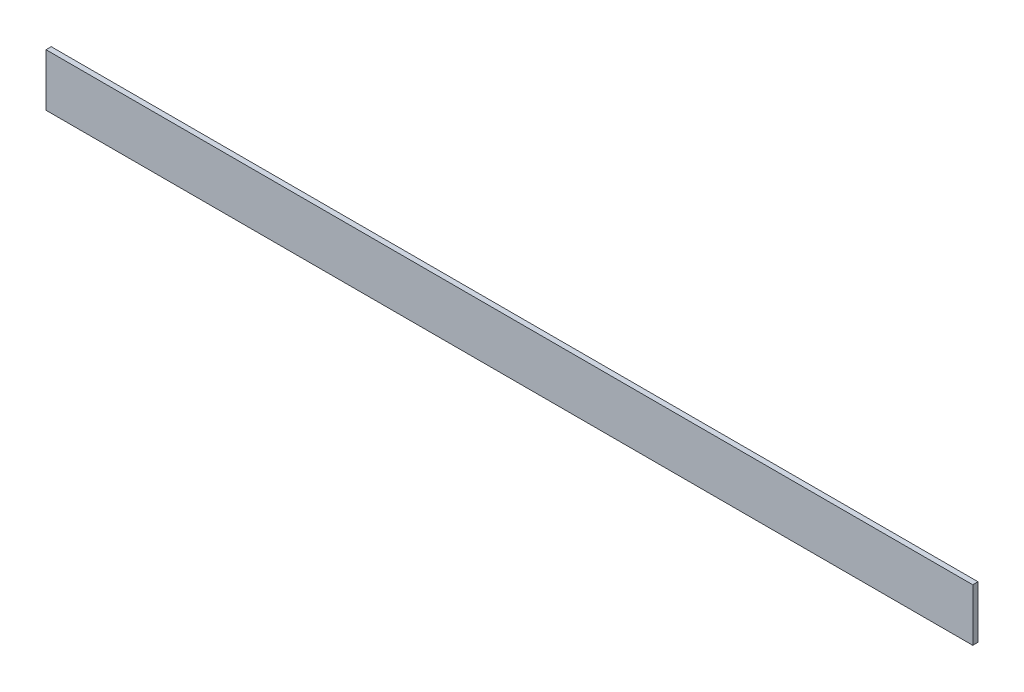
ISO-10303-21;
HEADER;
FILE_DESCRIPTION(('STEP AP214'),'2;1');
FILE_NAME('part.step','',(''),(''),'','','');
FILE_SCHEMA(('AUTOMOTIVE_DESIGN { 1 0 10303 214 1 1 1 1 }'));
ENDSEC;
DATA;
#1=APPLICATION_CONTEXT('core data for automotive mechanical design processes');
#2=APPLICATION_PROTOCOL_DEFINITION('international standard','automotive_design',2000,#1);
#3=PRODUCT_CONTEXT('',#1,'mechanical');
#4=PRODUCT('Part','Part','',(#3));
#5=PRODUCT_RELATED_PRODUCT_CATEGORY('part','',(#4));
#6=PRODUCT_DEFINITION_FORMATION('','',#4);
#7=PRODUCT_DEFINITION_CONTEXT('part definition',#1,'design');
#8=PRODUCT_DEFINITION('design','',#6,#7);
#9=PRODUCT_DEFINITION_SHAPE('','',#8);
#10=(LENGTH_UNIT() NAMED_UNIT(*) SI_UNIT(.MILLI.,.METRE.));
#11=(NAMED_UNIT(*) PLANE_ANGLE_UNIT() SI_UNIT($,.RADIAN.));
#12=(NAMED_UNIT(*) SI_UNIT($,.STERADIAN.) SOLID_ANGLE_UNIT());
#13=UNCERTAINTY_MEASURE_WITH_UNIT(LENGTH_MEASURE(1.E-05),#10,'distance_accuracy_value','');
#14=(GEOMETRIC_REPRESENTATION_CONTEXT(3) GLOBAL_UNCERTAINTY_ASSIGNED_CONTEXT((#13)) GLOBAL_UNIT_ASSIGNED_CONTEXT((#10,
#11,#12)) REPRESENTATION_CONTEXT('',''));
#15=CARTESIAN_POINT('',(0.,0.,0.));
#16=DIRECTION('',(0.,0.,1.));
#17=DIRECTION('',(1.,0.,0.));
#18=AXIS2_PLACEMENT_3D('',#15,#16,#17);
#19=CARTESIAN_POINT('',(530.,0.,0.));
#20=DIRECTION('',(0.,1.,0.));
#21=DIRECTION('',(0.,0.,1.));
#22=AXIS2_PLACEMENT_3D('',#19,#20,#21);
#23=PLANE('',#22);
#24=DIRECTION('',(0.,0.,-1.));
#25=VECTOR('',#24,1.);
#26=CARTESIAN_POINT('',(0.,0.,0.));
#27=LINE('',#26,#25);
#28=CARTESIAN_POINT('',(0.,0.,0.));
#29=VERTEX_POINT('',#28);
#30=CARTESIAN_POINT('',(0.,0.,-3.));
#31=VERTEX_POINT('',#30);
#32=EDGE_CURVE('E136',#29,#31,#27,.T.);
#33=ORIENTED_EDGE('',*,*,#32,.T.);
#34=DIRECTION('',(-1.,0.,0.));
#35=VECTOR('',#34,1.);
#36=CARTESIAN_POINT('',(0.,0.,-3.));
#37=LINE('',#36,#35);
#38=CARTESIAN_POINT('',(30.,0.,-3.));
#39=VERTEX_POINT('',#38);
#40=EDGE_CURVE('E121',#39,#31,#37,.T.);
#41=ORIENTED_EDGE('',*,*,#40,.F.);
#42=DIRECTION('',(0.,0.,1.));
#43=VECTOR('',#42,1.);
#44=CARTESIAN_POINT('',(30.,0.,-30.));
#45=LINE('',#44,#43);
#46=CARTESIAN_POINT('',(30.,0.,-30.));
#47=VERTEX_POINT('',#46);
#48=EDGE_CURVE('E113',#47,#39,#45,.T.);
#49=ORIENTED_EDGE('',*,*,#48,.F.);
#50=DIRECTION('',(-1.,0.,0.));
#51=VECTOR('',#50,1.);
#52=CARTESIAN_POINT('',(530.,0.,-30.));
#53=LINE('',#52,#51);
#54=CARTESIAN_POINT('',(500.,0.,-30.));
#55=VERTEX_POINT('',#54);
#56=EDGE_CURVE('E11',#55,#47,#53,.T.);
#57=ORIENTED_EDGE('',*,*,#56,.F.);
#58=DIRECTION('',(0.,0.,-1.));
#59=VECTOR('',#58,1.);
#60=CARTESIAN_POINT('',(500.,0.,-30.));
#61=LINE('',#60,#59);
#62=CARTESIAN_POINT('',(500.,0.,-2.99999999999999));
#63=VERTEX_POINT('',#62);
#64=EDGE_CURVE('E138',#63,#55,#61,.T.);
#65=ORIENTED_EDGE('',*,*,#64,.F.);
#66=DIRECTION('',(-1.,0.,0.));
#67=VECTOR('',#66,1.);
#68=CARTESIAN_POINT('',(530.,0.,-2.99999999999999));
#69=LINE('',#68,#67);
#70=CARTESIAN_POINT('',(530.,0.,-2.99999999999999));
#71=VERTEX_POINT('',#70);
#72=EDGE_CURVE('E171',#71,#63,#69,.T.);
#73=ORIENTED_EDGE('',*,*,#72,.F.);
#74=DIRECTION('',(0.,0.,-1.));
#75=VECTOR('',#74,1.);
#76=CARTESIAN_POINT('',(530.,0.,0.));
#77=LINE('',#76,#75);
#78=CARTESIAN_POINT('',(530.,0.,0.));
#79=VERTEX_POINT('',#78);
#80=EDGE_CURVE('E143',#79,#71,#77,.T.);
#81=ORIENTED_EDGE('',*,*,#80,.F.);
#82=DIRECTION('',(-1.,0.,0.));
#83=VECTOR('',#82,1.);
#84=CARTESIAN_POINT('',(530.,0.,0.));
#85=LINE('',#84,#83);
#86=EDGE_CURVE('E151',#79,#29,#85,.T.);
#87=ORIENTED_EDGE('',*,*,#86,.T.);
#88=EDGE_LOOP('',(#33,#41,#49,#57,#65,#73,#81,#87));
#89=FACE_BOUND('',#88,.T.);
#90=ADVANCED_FACE('F35',(#89),#23,.F.);
#91=CARTESIAN_POINT('',(530.,3.,-30.));
#92=DIRECTION('',(0.,0.,-1.));
#93=DIRECTION('',(-1.,0.,0.));
#94=AXIS2_PLACEMENT_3D('',#91,#92,#93);
#95=PLANE('',#94);
#96=DIRECTION('',(0.,-1.,0.));
#97=VECTOR('',#96,1.);
#98=CARTESIAN_POINT('',(30.,30.,-30.));
#99=LINE('',#98,#97);
#100=CARTESIAN_POINT('',(30.,3.,-30.));
#101=VERTEX_POINT('',#100);
#102=EDGE_CURVE('E110',#101,#47,#99,.T.);
#103=ORIENTED_EDGE('',*,*,#102,.F.);
#104=DIRECTION('',(-1.,0.,0.));
#105=VECTOR('',#104,1.);
#106=CARTESIAN_POINT('',(530.,3.,-30.));
#107=LINE('',#106,#105);
#108=CARTESIAN_POINT('',(500.,3.,-30.));
#109=VERTEX_POINT('',#108);
#110=EDGE_CURVE('E42',#109,#101,#107,.T.);
#111=ORIENTED_EDGE('',*,*,#110,.F.);
#112=DIRECTION('',(0.,-1.,0.));
#113=VECTOR('',#112,1.);
#114=CARTESIAN_POINT('',(500.,30.,-30.));
#115=LINE('',#114,#113);
#116=EDGE_CURVE('E130',#109,#55,#115,.T.);
#117=ORIENTED_EDGE('',*,*,#116,.T.);
#118=ORIENTED_EDGE('',*,*,#56,.T.);
#119=EDGE_LOOP('',(#103,#111,#117,#118));
#120=FACE_BOUND('',#119,.T.);
#121=ADVANCED_FACE('F129',(#120),#95,.T.);
#122=CARTESIAN_POINT('',(530.,3.,0.));
#123=DIRECTION('',(0.,1.,0.));
#124=DIRECTION('',(0.,0.,1.));
#125=AXIS2_PLACEMENT_3D('',#122,#123,#124);
#126=PLANE('',#125);
#127=DIRECTION('',(0.,0.,-1.));
#128=VECTOR('',#127,1.);
#129=CARTESIAN_POINT('',(30.,3.,0.));
#130=LINE('',#129,#128);
#131=CARTESIAN_POINT('',(30.,3.,-3.));
#132=VERTEX_POINT('',#131);
#133=EDGE_CURVE('E116',#132,#101,#130,.T.);
#134=ORIENTED_EDGE('',*,*,#133,.F.);
#135=DIRECTION('',(-1.,0.,0.));
#136=VECTOR('',#135,1.);
#137=CARTESIAN_POINT('',(530.,3.,-3.));
#138=LINE('',#137,#136);
#139=CARTESIAN_POINT('',(500.,3.,-2.99999999999999));
#140=VERTEX_POINT('',#139);
#141=EDGE_CURVE('E161',#140,#132,#138,.T.);
#142=ORIENTED_EDGE('',*,*,#141,.F.);
#143=DIRECTION('',(0.,0.,1.));
#144=VECTOR('',#143,1.);
#145=CARTESIAN_POINT('',(500.,3.,0.));
#146=LINE('',#145,#144);
#147=EDGE_CURVE('E133',#109,#140,#146,.T.);
#148=ORIENTED_EDGE('',*,*,#147,.F.);
#149=ORIENTED_EDGE('',*,*,#110,.T.);
#150=EDGE_LOOP('',(#134,#142,#148,#149));
#151=FACE_BOUND('',#150,.T.);
#152=ADVANCED_FACE('F164',(#151),#126,.T.);
#153=CARTESIAN_POINT('',(530.,30.,-3.));
#154=DIRECTION('',(0.,0.,-1.));
#155=DIRECTION('',(0.,1.,0.));
#156=AXIS2_PLACEMENT_3D('',#153,#154,#155);
#157=PLANE('',#156);
#158=ORIENTED_EDGE('',*,*,#141,.T.);
#159=DIRECTION('',(0.,-1.,0.));
#160=VECTOR('',#159,1.);
#161=CARTESIAN_POINT('',(30.,30.,-3.));
#162=LINE('',#161,#160);
#163=EDGE_CURVE('E120',#132,#39,#162,.T.);
#164=ORIENTED_EDGE('',*,*,#163,.T.);
#165=ORIENTED_EDGE('',*,*,#40,.T.);
#166=DIRECTION('',(0.,-1.,0.));
#167=VECTOR('',#166,1.);
#168=CARTESIAN_POINT('',(0.,30.,-3.));
#169=LINE('',#168,#167);
#170=CARTESIAN_POINT('',(0.,30.,-3.));
#171=VERTEX_POINT('',#170);
#172=EDGE_CURVE('E49',#171,#31,#169,.T.);
#173=ORIENTED_EDGE('',*,*,#172,.F.);
#174=DIRECTION('',(-1.,0.,0.));
#175=VECTOR('',#174,1.);
#176=CARTESIAN_POINT('',(530.,30.,-3.));
#177=LINE('',#176,#175);
#178=CARTESIAN_POINT('',(530.,30.,-3.));
#179=VERTEX_POINT('',#178);
#180=EDGE_CURVE('E80',#179,#171,#177,.T.);
#181=ORIENTED_EDGE('',*,*,#180,.F.);
#182=DIRECTION('',(0.,-1.,0.));
#183=VECTOR('',#182,1.);
#184=CARTESIAN_POINT('',(530.,30.,-3.));
#185=LINE('',#184,#183);
#186=EDGE_CURVE('E145',#179,#71,#185,.T.);
#187=ORIENTED_EDGE('',*,*,#186,.T.);
#188=ORIENTED_EDGE('',*,*,#72,.T.);
#189=DIRECTION('',(0.,-1.,0.));
#190=VECTOR('',#189,1.);
#191=CARTESIAN_POINT('',(500.,30.,-2.99999999999999));
#192=LINE('',#191,#190);
#193=EDGE_CURVE('E134',#140,#63,#192,.T.);
#194=ORIENTED_EDGE('',*,*,#193,.F.);
#195=EDGE_LOOP('',(#158,#164,#165,#173,#181,#187,#188,#194));
#196=FACE_BOUND('',#195,.T.);
#197=ADVANCED_FACE('F169',(#196),#157,.T.);
#198=CARTESIAN_POINT('',(530.,30.,0.));
#199=DIRECTION('',(0.,1.,0.));
#200=DIRECTION('',(0.,0.,1.));
#201=AXIS2_PLACEMENT_3D('',#198,#199,#200);
#202=PLANE('',#201);
#203=DIRECTION('',(0.,0.,-1.));
#204=VECTOR('',#203,1.);
#205=CARTESIAN_POINT('',(0.,30.,0.));
#206=LINE('',#205,#204);
#207=CARTESIAN_POINT('',(0.,30.,0.));
#208=VERTEX_POINT('',#207);
#209=EDGE_CURVE('E154',#208,#171,#206,.T.);
#210=ORIENTED_EDGE('',*,*,#209,.F.);
#211=DIRECTION('',(-1.,0.,0.));
#212=VECTOR('',#211,1.);
#213=CARTESIAN_POINT('',(530.,30.,0.));
#214=LINE('',#213,#212);
#215=CARTESIAN_POINT('',(530.,30.,0.));
#216=VERTEX_POINT('',#215);
#217=EDGE_CURVE('E158',#216,#208,#214,.T.);
#218=ORIENTED_EDGE('',*,*,#217,.F.);
#219=DIRECTION('',(0.,0.,-1.));
#220=VECTOR('',#219,1.);
#221=CARTESIAN_POINT('',(530.,30.,0.));
#222=LINE('',#221,#220);
#223=EDGE_CURVE('E147',#216,#179,#222,.T.);
#224=ORIENTED_EDGE('',*,*,#223,.T.);
#225=ORIENTED_EDGE('',*,*,#180,.T.);
#226=EDGE_LOOP('',(#210,#218,#224,#225));
#227=FACE_BOUND('',#226,.T.);
#228=ADVANCED_FACE('F179',(#227),#202,.T.);
#229=CARTESIAN_POINT('',(530.,30.,0.));
#230=DIRECTION('',(0.,0.,-1.));
#231=DIRECTION('',(0.,1.,0.));
#232=AXIS2_PLACEMENT_3D('',#229,#230,#231);
#233=PLANE('',#232);
#234=DIRECTION('',(0.,-1.,0.));
#235=VECTOR('',#234,1.);
#236=CARTESIAN_POINT('',(0.,30.,0.));
#237=LINE('',#236,#235);
#238=EDGE_CURVE('E75',#208,#29,#237,.T.);
#239=ORIENTED_EDGE('',*,*,#238,.T.);
#240=ORIENTED_EDGE('',*,*,#86,.F.);
#241=DIRECTION('',(0.,-1.,0.));
#242=VECTOR('',#241,1.);
#243=CARTESIAN_POINT('',(530.,30.,0.));
#244=LINE('',#243,#242);
#245=EDGE_CURVE('E58',#216,#79,#244,.T.);
#246=ORIENTED_EDGE('',*,*,#245,.F.);
#247=ORIENTED_EDGE('',*,*,#217,.T.);
#248=EDGE_LOOP('',(#239,#240,#246,#247));
#249=FACE_BOUND('',#248,.T.);
#250=ADVANCED_FACE('F182',(#249),#233,.F.);
#251=CARTESIAN_POINT('',(530.,0.,0.));
#252=DIRECTION('',(-1.,0.,0.));
#253=DIRECTION('',(0.,0.,1.));
#254=AXIS2_PLACEMENT_3D('',#251,#252,#253);
#255=PLANE('',#254);
#256=ORIENTED_EDGE('',*,*,#80,.T.);
#257=ORIENTED_EDGE('',*,*,#186,.F.);
#258=ORIENTED_EDGE('',*,*,#223,.F.);
#259=ORIENTED_EDGE('',*,*,#245,.T.);
#260=EDGE_LOOP('',(#256,#257,#258,#259));
#261=FACE_BOUND('',#260,.T.);
#262=ADVANCED_FACE('F180',(#261),#255,.F.);
#263=CARTESIAN_POINT('',(0.,0.,0.));
#264=DIRECTION('',(-1.,0.,0.));
#265=DIRECTION('',(0.,0.,1.));
#266=AXIS2_PLACEMENT_3D('',#263,#264,#265);
#267=PLANE('',#266);
#268=ORIENTED_EDGE('',*,*,#172,.T.);
#269=ORIENTED_EDGE('',*,*,#32,.F.);
#270=ORIENTED_EDGE('',*,*,#238,.F.);
#271=ORIENTED_EDGE('',*,*,#209,.T.);
#272=EDGE_LOOP('',(#268,#269,#270,#271));
#273=FACE_BOUND('',#272,.T.);
#274=ADVANCED_FACE('F176',(#273),#267,.T.);
#275=CARTESIAN_POINT('',(500.,30.,-30.));
#276=DIRECTION('',(-1.,0.,0.));
#277=DIRECTION('',(0.,0.,1.));
#278=AXIS2_PLACEMENT_3D('',#275,#276,#277);
#279=PLANE('',#278);
#280=ORIENTED_EDGE('',*,*,#147,.T.);
#281=ORIENTED_EDGE('',*,*,#193,.T.);
#282=ORIENTED_EDGE('',*,*,#64,.T.);
#283=ORIENTED_EDGE('',*,*,#116,.F.);
#284=EDGE_LOOP('',(#280,#281,#282,#283));
#285=FACE_BOUND('',#284,.T.);
#286=ADVANCED_FACE('F167',(#285),#279,.F.);
#287=CARTESIAN_POINT('',(30.,30.,-30.));
#288=DIRECTION('',(1.,0.,0.));
#289=DIRECTION('',(0.,0.,-1.));
#290=AXIS2_PLACEMENT_3D('',#287,#288,#289);
#291=PLANE('',#290);
#292=ORIENTED_EDGE('',*,*,#133,.T.);
#293=ORIENTED_EDGE('',*,*,#102,.T.);
#294=ORIENTED_EDGE('',*,*,#48,.T.);
#295=ORIENTED_EDGE('',*,*,#163,.F.);
#296=EDGE_LOOP('',(#292,#293,#294,#295));
#297=FACE_BOUND('',#296,.T.);
#298=ADVANCED_FACE('F112',(#297),#291,.F.);
#299=CLOSED_SHELL('',(#90,#121,#152,#197,#228,#250,#262,#274,#286,#298));
#300=MANIFOLD_SOLID_BREP('B2',#299);
#301=ADVANCED_BREP_SHAPE_REPRESENTATION('',(#18,#300),#14);
#302=SHAPE_DEFINITION_REPRESENTATION(#9,#301);
ENDSEC;
END-ISO-10303-21;
